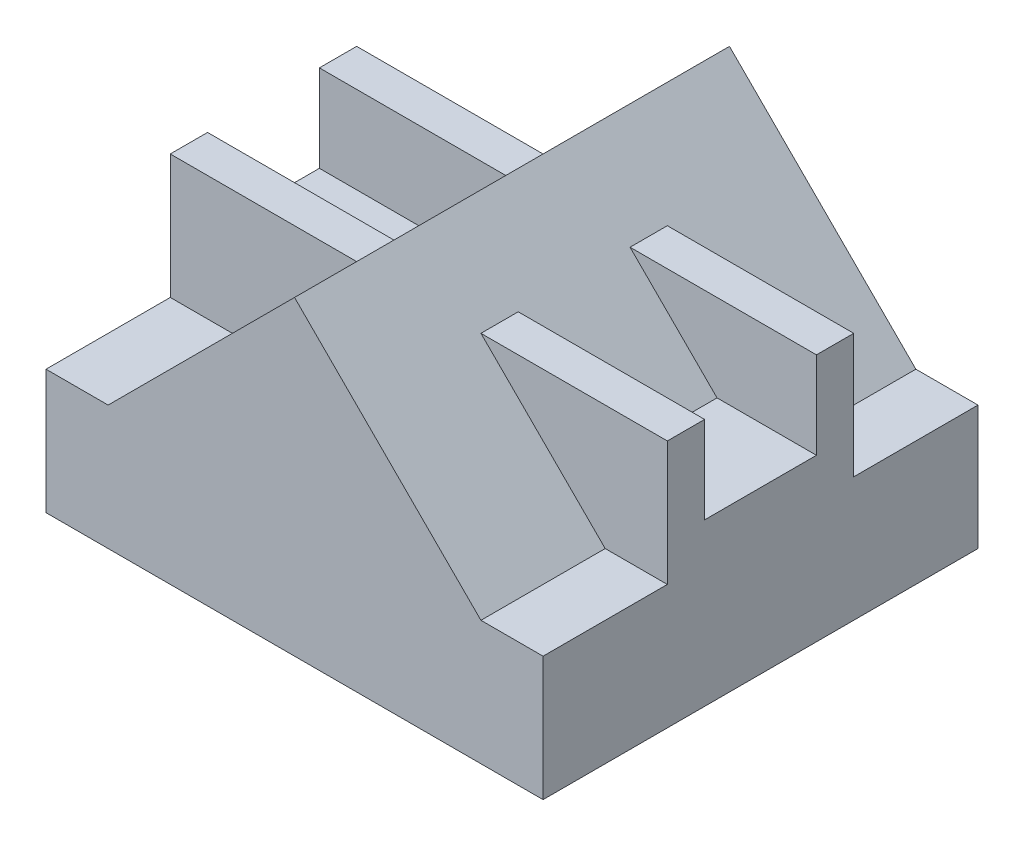
ISO-10303-21;
HEADER;
FILE_DESCRIPTION(('STEP AP214'),'2;1');
FILE_NAME('part.step','',(''),(''),'','','');
FILE_SCHEMA(('AUTOMOTIVE_DESIGN { 1 0 10303 214 1 1 1 1 }'));
ENDSEC;
DATA;
#1=APPLICATION_CONTEXT('core data for automotive mechanical design processes');
#2=APPLICATION_PROTOCOL_DEFINITION('international standard','automotive_design',2000,#1);
#3=PRODUCT_CONTEXT('',#1,'mechanical');
#4=PRODUCT('Part','Part','',(#3));
#5=PRODUCT_RELATED_PRODUCT_CATEGORY('part','',(#4));
#6=PRODUCT_DEFINITION_FORMATION('','',#4);
#7=PRODUCT_DEFINITION_CONTEXT('part definition',#1,'design');
#8=PRODUCT_DEFINITION('design','',#6,#7);
#9=PRODUCT_DEFINITION_SHAPE('','',#8);
#10=(LENGTH_UNIT() NAMED_UNIT(*) SI_UNIT(.MILLI.,.METRE.));
#11=(NAMED_UNIT(*) PLANE_ANGLE_UNIT() SI_UNIT($,.RADIAN.));
#12=(NAMED_UNIT(*) SI_UNIT($,.STERADIAN.) SOLID_ANGLE_UNIT());
#13=UNCERTAINTY_MEASURE_WITH_UNIT(LENGTH_MEASURE(1.E-05),#10,'distance_accuracy_value','');
#14=(GEOMETRIC_REPRESENTATION_CONTEXT(3) GLOBAL_UNCERTAINTY_ASSIGNED_CONTEXT((#13)) GLOBAL_UNIT_ASSIGNED_CONTEXT((#10,
#11,#12)) REPRESENTATION_CONTEXT('',''));
#15=CARTESIAN_POINT('',(0.,0.,0.));
#16=DIRECTION('',(0.,0.,1.));
#17=DIRECTION('',(1.,0.,0.));
#18=AXIS2_PLACEMENT_3D('',#15,#16,#17);
#19=CARTESIAN_POINT('',(0.,50.,0.));
#20=DIRECTION('',(0.,1.,0.));
#21=DIRECTION('',(0.,0.,1.));
#22=AXIS2_PLACEMENT_3D('',#19,#20,#21);
#23=PLANE('',#22);
#24=DIRECTION('',(1.,0.,0.));
#25=VECTOR('',#24,1.);
#26=CARTESIAN_POINT('',(-190.1387818866,50.,37.5000000000001));
#27=LINE('',#26,#25);
#28=CARTESIAN_POINT('',(75.,50.,37.5));
#29=VERTEX_POINT('',#28);
#30=CARTESIAN_POINT('',(100.,50.,37.5000000000001));
#31=VERTEX_POINT('',#30);
#32=EDGE_CURVE('E256',#29,#31,#27,.T.);
#33=ORIENTED_EDGE('',*,*,#32,.F.);
#34=DIRECTION('',(0.,0.,1.));
#35=VECTOR('',#34,1.);
#36=CARTESIAN_POINT('',(75.,50.,-255.205098312484));
#37=LINE('',#36,#35);
#38=CARTESIAN_POINT('',(75.,50.,87.5));
#39=VERTEX_POINT('',#38);
#40=EDGE_CURVE('E331',#29,#39,#37,.T.);
#41=ORIENTED_EDGE('',*,*,#40,.T.);
#42=DIRECTION('',(1.,0.,0.));
#43=VECTOR('',#42,1.);
#44=CARTESIAN_POINT('',(-99.9999999999999,50.,87.5));
#45=LINE('',#44,#43);
#46=CARTESIAN_POINT('',(100.,50.,87.5));
#47=VERTEX_POINT('',#46);
#48=EDGE_CURVE('E355',#39,#47,#45,.T.);
#49=ORIENTED_EDGE('',*,*,#48,.T.);
#50=DIRECTION('',(0.,0.,-1.));
#51=VECTOR('',#50,1.);
#52=CARTESIAN_POINT('',(100.,50.,-87.5));
#53=LINE('',#52,#51);
#54=EDGE_CURVE('E67',#47,#31,#53,.T.);
#55=ORIENTED_EDGE('',*,*,#54,.T.);
#56=EDGE_LOOP('',(#33,#41,#49,#55));
#57=FACE_BOUND('',#56,.T.);
#58=ADVANCED_FACE('F43',(#57),#23,.T.);
#59=CARTESIAN_POINT('',(-100.,50.,37.5000000000001));
#60=VERTEX_POINT('',#59);
#61=CARTESIAN_POINT('',(-75.,50.,37.5000000000001));
#62=VERTEX_POINT('',#61);
#63=EDGE_CURVE('E251',#60,#62,#27,.T.);
#64=ORIENTED_EDGE('',*,*,#63,.F.);
#65=DIRECTION('',(0.,0.,1.));
#66=VECTOR('',#65,1.);
#67=CARTESIAN_POINT('',(-100.,50.,-87.5));
#68=LINE('',#67,#66);
#69=CARTESIAN_POINT('',(-99.9999999999999,50.,87.5));
#70=VERTEX_POINT('',#69);
#71=EDGE_CURVE('E351',#60,#70,#68,.T.);
#72=ORIENTED_EDGE('',*,*,#71,.T.);
#73=CARTESIAN_POINT('',(-75.,50.,87.5));
#74=VERTEX_POINT('',#73);
#75=EDGE_CURVE('E356',#70,#74,#45,.T.);
#76=ORIENTED_EDGE('',*,*,#75,.T.);
#77=DIRECTION('',(0.,0.,1.));
#78=VECTOR('',#77,1.);
#79=CARTESIAN_POINT('',(-75.,50.,-255.205098312484));
#80=LINE('',#79,#78);
#81=EDGE_CURVE('E334',#62,#74,#80,.T.);
#82=ORIENTED_EDGE('',*,*,#81,.F.);
#83=EDGE_LOOP('',(#64,#72,#76,#82));
#84=FACE_BOUND('',#83,.T.);
#85=ADVANCED_FACE('F454',(#84),#23,.T.);
#86=DIRECTION('',(1.,0.,0.));
#87=VECTOR('',#86,1.);
#88=CARTESIAN_POINT('',(-190.1387818866,50.,-37.5));
#89=LINE('',#88,#87);
#90=CARTESIAN_POINT('',(75.,50.,-37.5));
#91=VERTEX_POINT('',#90);
#92=CARTESIAN_POINT('',(100.,50.,-37.5000000000001));
#93=VERTEX_POINT('',#92);
#94=EDGE_CURVE('E59',#91,#93,#89,.T.);
#95=ORIENTED_EDGE('',*,*,#94,.T.);
#96=CARTESIAN_POINT('',(100.,50.,-87.5));
#97=VERTEX_POINT('',#96);
#98=EDGE_CURVE('E226',#93,#97,#53,.T.);
#99=ORIENTED_EDGE('',*,*,#98,.T.);
#100=DIRECTION('',(-1.,0.,0.));
#101=VECTOR('',#100,1.);
#102=CARTESIAN_POINT('',(-100.,50.,-87.5));
#103=LINE('',#102,#101);
#104=CARTESIAN_POINT('',(75.,50.,-87.5));
#105=VERTEX_POINT('',#104);
#106=EDGE_CURVE('E348',#97,#105,#103,.T.);
#107=ORIENTED_EDGE('',*,*,#106,.T.);
#108=EDGE_CURVE('E338',#105,#91,#37,.T.);
#109=ORIENTED_EDGE('',*,*,#108,.T.);
#110=EDGE_LOOP('',(#95,#99,#107,#109));
#111=FACE_BOUND('',#110,.T.);
#112=ADVANCED_FACE('F434',(#111),#23,.T.);
#113=CARTESIAN_POINT('',(100.,50.,-87.5));
#114=DIRECTION('',(-1.,0.,0.));
#115=DIRECTION('',(0.,0.,1.));
#116=AXIS2_PLACEMENT_3D('',#113,#114,#115);
#117=PLANE('',#116);
#118=DIRECTION('',(0.,0.,-1.));
#119=VECTOR('',#118,1.);
#120=CARTESIAN_POINT('',(100.,0.,-87.5));
#121=LINE('',#120,#119);
#122=CARTESIAN_POINT('',(100.,0.,87.5));
#123=VERTEX_POINT('',#122);
#124=CARTESIAN_POINT('',(100.,0.,-87.5));
#125=VERTEX_POINT('',#124);
#126=EDGE_CURVE('E344',#123,#125,#121,.T.);
#127=ORIENTED_EDGE('',*,*,#126,.T.);
#128=DIRECTION('',(0.,-1.,0.));
#129=VECTOR('',#128,1.);
#130=CARTESIAN_POINT('',(100.,50.,-87.5));
#131=LINE('',#130,#129);
#132=EDGE_CURVE('E383',#97,#125,#131,.T.);
#133=ORIENTED_EDGE('',*,*,#132,.F.);
#134=ORIENTED_EDGE('',*,*,#98,.F.);
#135=DIRECTION('',(0.,1.,0.));
#136=VECTOR('',#135,1.);
#137=CARTESIAN_POINT('',(100.,100.,-37.5000000000001));
#138=LINE('',#137,#136);
#139=CARTESIAN_POINT('',(100.,100.,-37.5000000000001));
#140=VERTEX_POINT('',#139);
#141=EDGE_CURVE('E205',#93,#140,#138,.T.);
#142=ORIENTED_EDGE('',*,*,#141,.T.);
#143=DIRECTION('',(0.,0.,1.));
#144=VECTOR('',#143,1.);
#145=CARTESIAN_POINT('',(100.,100.,-22.5000000000001));
#146=LINE('',#145,#144);
#147=CARTESIAN_POINT('',(100.,100.,-22.5000000000001));
#148=VERTEX_POINT('',#147);
#149=EDGE_CURVE('E214',#140,#148,#146,.T.);
#150=ORIENTED_EDGE('',*,*,#149,.T.);
#151=DIRECTION('',(0.,-1.,0.));
#152=VECTOR('',#151,1.);
#153=CARTESIAN_POINT('',(100.,65.,-22.5));
#154=LINE('',#153,#152);
#155=CARTESIAN_POINT('',(100.,65.,-22.5));
#156=VERTEX_POINT('',#155);
#157=EDGE_CURVE('E222',#148,#156,#154,.T.);
#158=ORIENTED_EDGE('',*,*,#157,.T.);
#159=DIRECTION('',(0.,0.,1.));
#160=VECTOR('',#159,1.);
#161=CARTESIAN_POINT('',(100.,65.,22.5));
#162=LINE('',#161,#160);
#163=CARTESIAN_POINT('',(100.,65.,22.5));
#164=VERTEX_POINT('',#163);
#165=EDGE_CURVE('E235',#156,#164,#162,.T.);
#166=ORIENTED_EDGE('',*,*,#165,.T.);
#167=DIRECTION('',(0.,1.,0.));
#168=VECTOR('',#167,1.);
#169=CARTESIAN_POINT('',(100.,100.,22.5));
#170=LINE('',#169,#168);
#171=CARTESIAN_POINT('',(100.,100.,22.5));
#172=VERTEX_POINT('',#171);
#173=EDGE_CURVE('E239',#164,#172,#170,.T.);
#174=ORIENTED_EDGE('',*,*,#173,.T.);
#175=DIRECTION('',(0.,0.,1.));
#176=VECTOR('',#175,1.);
#177=CARTESIAN_POINT('',(100.,100.,37.5));
#178=LINE('',#177,#176);
#179=CARTESIAN_POINT('',(100.,100.,37.5));
#180=VERTEX_POINT('',#179);
#181=EDGE_CURVE('E243',#172,#180,#178,.T.);
#182=ORIENTED_EDGE('',*,*,#181,.T.);
#183=DIRECTION('',(0.,-1.,0.));
#184=VECTOR('',#183,1.);
#185=CARTESIAN_POINT('',(100.,50.,37.5));
#186=LINE('',#185,#184);
#187=EDGE_CURVE('E247',#180,#31,#186,.T.);
#188=ORIENTED_EDGE('',*,*,#187,.T.);
#189=ORIENTED_EDGE('',*,*,#54,.F.);
#190=DIRECTION('',(0.,-1.,0.));
#191=VECTOR('',#190,1.);
#192=CARTESIAN_POINT('',(100.,50.,87.5));
#193=LINE('',#192,#191);
#194=EDGE_CURVE('E360',#47,#123,#193,.T.);
#195=ORIENTED_EDGE('',*,*,#194,.T.);
#196=EDGE_LOOP('',(#127,#133,#134,#142,#150,#158,#166,#174,#182,#188,#189,#195));
#197=FACE_BOUND('',#196,.T.);
#198=ADVANCED_FACE('F45',(#197),#117,.F.);
#199=CARTESIAN_POINT('',(-100.,50.,-87.5));
#200=DIRECTION('',(0.,0.,1.));
#201=DIRECTION('',(1.,0.,0.));
#202=AXIS2_PLACEMENT_3D('',#199,#200,#201);
#203=PLANE('',#202);
#204=DIRECTION('',(-1.,0.,0.));
#205=VECTOR('',#204,1.);
#206=CARTESIAN_POINT('',(-100.,0.,-87.5));
#207=LINE('',#206,#205);
#208=CARTESIAN_POINT('',(-100.,0.,-87.5));
#209=VERTEX_POINT('',#208);
#210=EDGE_CURVE('E363',#125,#209,#207,.T.);
#211=ORIENTED_EDGE('',*,*,#210,.T.);
#212=DIRECTION('',(0.,-1.,0.));
#213=VECTOR('',#212,1.);
#214=CARTESIAN_POINT('',(-100.,50.,-87.5));
#215=LINE('',#214,#213);
#216=CARTESIAN_POINT('',(-100.,50.,-87.5));
#217=VERTEX_POINT('',#216);
#218=EDGE_CURVE('E379',#217,#209,#215,.T.);
#219=ORIENTED_EDGE('',*,*,#218,.F.);
#220=CARTESIAN_POINT('',(-75.,50.,-87.5));
#221=VERTEX_POINT('',#220);
#222=EDGE_CURVE('E347',#221,#217,#103,.T.);
#223=ORIENTED_EDGE('',*,*,#222,.F.);
#224=DIRECTION('',(0.707106781186548,0.707106781186548,0.));
#225=VECTOR('',#224,1.);
#226=CARTESIAN_POINT('',(-75.,50.,-87.5));
#227=LINE('',#226,#225);
#228=CARTESIAN_POINT('',(0.,125.,-87.5));
#229=VERTEX_POINT('',#228);
#230=EDGE_CURVE('E319',#221,#229,#227,.T.);
#231=ORIENTED_EDGE('',*,*,#230,.T.);
#232=DIRECTION('',(0.707106781186548,-0.707106781186547,0.));
#233=VECTOR('',#232,1.);
#234=CARTESIAN_POINT('',(0.,125.,-87.5));
#235=LINE('',#234,#233);
#236=EDGE_CURVE('E322',#229,#105,#235,.T.);
#237=ORIENTED_EDGE('',*,*,#236,.T.);
#238=ORIENTED_EDGE('',*,*,#106,.F.);
#239=ORIENTED_EDGE('',*,*,#132,.T.);
#240=EDGE_LOOP('',(#211,#219,#223,#231,#237,#238,#239));
#241=FACE_BOUND('',#240,.T.);
#242=ADVANCED_FACE('F437',(#241),#203,.F.);
#243=CARTESIAN_POINT('',(-100.,50.,-87.5));
#244=DIRECTION('',(1.,0.,0.));
#245=DIRECTION('',(0.,0.,-1.));
#246=AXIS2_PLACEMENT_3D('',#243,#244,#245);
#247=PLANE('',#246);
#248=DIRECTION('',(0.,0.,1.));
#249=VECTOR('',#248,1.);
#250=CARTESIAN_POINT('',(-100.,0.,-87.5));
#251=LINE('',#250,#249);
#252=CARTESIAN_POINT('',(-99.9999999999999,0.,87.5));
#253=VERTEX_POINT('',#252);
#254=EDGE_CURVE('E366',#209,#253,#251,.T.);
#255=ORIENTED_EDGE('',*,*,#254,.T.);
#256=DIRECTION('',(0.,-1.,0.));
#257=VECTOR('',#256,1.);
#258=CARTESIAN_POINT('',(-99.9999999999999,50.,87.5));
#259=LINE('',#258,#257);
#260=EDGE_CURVE('E375',#70,#253,#259,.T.);
#261=ORIENTED_EDGE('',*,*,#260,.F.);
#262=ORIENTED_EDGE('',*,*,#71,.F.);
#263=DIRECTION('',(0.,1.,0.));
#264=VECTOR('',#263,1.);
#265=CARTESIAN_POINT('',(-100.,50.,37.5000000000001));
#266=LINE('',#265,#264);
#267=CARTESIAN_POINT('',(-100.,100.,37.5000000000001));
#268=VERTEX_POINT('',#267);
#269=EDGE_CURVE('E230',#60,#268,#266,.T.);
#270=ORIENTED_EDGE('',*,*,#269,.T.);
#271=DIRECTION('',(0.,0.,-1.));
#272=VECTOR('',#271,1.);
#273=CARTESIAN_POINT('',(-100.,100.,37.5000000000001));
#274=LINE('',#273,#272);
#275=CARTESIAN_POINT('',(-100.,100.,22.5000000000001));
#276=VERTEX_POINT('',#275);
#277=EDGE_CURVE('E476',#268,#276,#274,.T.);
#278=ORIENTED_EDGE('',*,*,#277,.T.);
#279=DIRECTION('',(0.,-1.,0.));
#280=VECTOR('',#279,1.);
#281=CARTESIAN_POINT('',(-100.,100.,22.5000000000001));
#282=LINE('',#281,#280);
#283=CARTESIAN_POINT('',(-100.,65.,22.5000000000001));
#284=VERTEX_POINT('',#283);
#285=EDGE_CURVE('E478',#276,#284,#282,.T.);
#286=ORIENTED_EDGE('',*,*,#285,.T.);
#287=DIRECTION('',(0.,0.,-1.));
#288=VECTOR('',#287,1.);
#289=CARTESIAN_POINT('',(-100.,65.,22.5000000000001));
#290=LINE('',#289,#288);
#291=CARTESIAN_POINT('',(-100.,65.,-22.5));
#292=VERTEX_POINT('',#291);
#293=EDGE_CURVE('E480',#284,#292,#290,.T.);
#294=ORIENTED_EDGE('',*,*,#293,.T.);
#295=DIRECTION('',(0.,1.,0.));
#296=VECTOR('',#295,1.);
#297=CARTESIAN_POINT('',(-100.,65.,-22.5));
#298=LINE('',#297,#296);
#299=CARTESIAN_POINT('',(-100.,100.,-22.5));
#300=VERTEX_POINT('',#299);
#301=EDGE_CURVE('E483',#292,#300,#298,.T.);
#302=ORIENTED_EDGE('',*,*,#301,.T.);
#303=DIRECTION('',(0.,0.,-1.));
#304=VECTOR('',#303,1.);
#305=CARTESIAN_POINT('',(-100.,100.,-22.5));
#306=LINE('',#305,#304);
#307=CARTESIAN_POINT('',(-100.,100.,-37.5));
#308=VERTEX_POINT('',#307);
#309=EDGE_CURVE('E255',#300,#308,#306,.T.);
#310=ORIENTED_EDGE('',*,*,#309,.T.);
#311=DIRECTION('',(0.,-1.,0.));
#312=VECTOR('',#311,1.);
#313=CARTESIAN_POINT('',(-100.,100.,-37.5));
#314=LINE('',#313,#312);
#315=CARTESIAN_POINT('',(-100.,50.,-37.5));
#316=VERTEX_POINT('',#315);
#317=EDGE_CURVE('E286',#308,#316,#314,.T.);
#318=ORIENTED_EDGE('',*,*,#317,.T.);
#319=EDGE_CURVE('E352',#217,#316,#68,.T.);
#320=ORIENTED_EDGE('',*,*,#319,.F.);
#321=ORIENTED_EDGE('',*,*,#218,.T.);
#322=EDGE_LOOP('',(#255,#261,#262,#270,#278,#286,#294,#302,#310,#318,#320,#321));
#323=FACE_BOUND('',#322,.T.);
#324=ADVANCED_FACE('F465',(#323),#247,.F.);
#325=CARTESIAN_POINT('',(-99.9999999999999,50.,87.5));
#326=DIRECTION('',(0.,0.,-1.));
#327=DIRECTION('',(-1.,0.,0.));
#328=AXIS2_PLACEMENT_3D('',#325,#326,#327);
#329=PLANE('',#328);
#330=DIRECTION('',(1.,0.,0.));
#331=VECTOR('',#330,1.);
#332=CARTESIAN_POINT('',(-99.9999999999999,0.,87.5));
#333=LINE('',#332,#331);
#334=EDGE_CURVE('E369',#253,#123,#333,.T.);
#335=ORIENTED_EDGE('',*,*,#334,.T.);
#336=ORIENTED_EDGE('',*,*,#194,.F.);
#337=ORIENTED_EDGE('',*,*,#48,.F.);
#338=DIRECTION('',(-0.707106781186548,0.707106781186547,0.));
#339=VECTOR('',#338,1.);
#340=CARTESIAN_POINT('',(0.,125.,87.5));
#341=LINE('',#340,#339);
#342=CARTESIAN_POINT('',(0.,125.,87.5));
#343=VERTEX_POINT('',#342);
#344=EDGE_CURVE('E318',#39,#343,#341,.T.);
#345=ORIENTED_EDGE('',*,*,#344,.T.);
#346=DIRECTION('',(-0.707106781186548,-0.707106781186548,0.));
#347=VECTOR('',#346,1.);
#348=CARTESIAN_POINT('',(-75.,50.,87.5));
#349=LINE('',#348,#347);
#350=EDGE_CURVE('E327',#343,#74,#349,.T.);
#351=ORIENTED_EDGE('',*,*,#350,.T.);
#352=ORIENTED_EDGE('',*,*,#75,.F.);
#353=ORIENTED_EDGE('',*,*,#260,.T.);
#354=EDGE_LOOP('',(#335,#336,#337,#345,#351,#352,#353));
#355=FACE_BOUND('',#354,.T.);
#356=ADVANCED_FACE('F447',(#355),#329,.F.);
#357=CARTESIAN_POINT('',(-75.,50.,-37.5));
#358=VERTEX_POINT('',#357);
#359=EDGE_CURVE('E211',#316,#358,#89,.T.);
#360=ORIENTED_EDGE('',*,*,#359,.T.);
#361=EDGE_CURVE('E323',#221,#358,#80,.T.);
#362=ORIENTED_EDGE('',*,*,#361,.F.);
#363=ORIENTED_EDGE('',*,*,#222,.T.);
#364=ORIENTED_EDGE('',*,*,#319,.T.);
#365=EDGE_LOOP('',(#360,#362,#363,#364));
#366=FACE_BOUND('',#365,.T.);
#367=ADVANCED_FACE('F469',(#366),#23,.T.);
#368=CARTESIAN_POINT('',(0.,0.,0.));
#369=DIRECTION('',(0.,1.,0.));
#370=DIRECTION('',(0.,0.,1.));
#371=AXIS2_PLACEMENT_3D('',#368,#369,#370);
#372=PLANE('',#371);
#373=ORIENTED_EDGE('',*,*,#126,.F.);
#374=ORIENTED_EDGE('',*,*,#334,.F.);
#375=ORIENTED_EDGE('',*,*,#254,.F.);
#376=ORIENTED_EDGE('',*,*,#210,.F.);
#377=EDGE_LOOP('',(#373,#374,#375,#376));
#378=FACE_BOUND('',#377,.T.);
#379=ADVANCED_FACE('F462',(#378),#372,.F.);
#380=CARTESIAN_POINT('',(-75.,50.,-255.205098312484));
#381=DIRECTION('',(-0.707106781186548,0.707106781186548,0.));
#382=DIRECTION('',(-0.707106781186548,-0.707106781186548,0.));
#383=AXIS2_PLACEMENT_3D('',#380,#381,#382);
#384=PLANE('',#383);
#385=DIRECTION('',(0.707106781186548,0.707106781186548,0.));
#386=VECTOR('',#385,1.);
#387=CARTESIAN_POINT('',(-75.,50.,37.5000000000001));
#388=LINE('',#387,#386);
#389=CARTESIAN_POINT('',(-25.,100.,37.5000000000001));
#390=VERTEX_POINT('',#389);
#391=EDGE_CURVE('E314',#62,#390,#388,.T.);
#392=ORIENTED_EDGE('',*,*,#391,.F.);
#393=ORIENTED_EDGE('',*,*,#81,.T.);
#394=ORIENTED_EDGE('',*,*,#350,.F.);
#395=DIRECTION('',(0.,0.,1.));
#396=VECTOR('',#395,1.);
#397=CARTESIAN_POINT('',(0.,125.,-255.205098312484));
#398=LINE('',#397,#396);
#399=EDGE_CURVE('E335',#229,#343,#398,.T.);
#400=ORIENTED_EDGE('',*,*,#399,.F.);
#401=ORIENTED_EDGE('',*,*,#230,.F.);
#402=ORIENTED_EDGE('',*,*,#361,.T.);
#403=DIRECTION('',(-0.707106781186548,-0.707106781186548,0.));
#404=VECTOR('',#403,1.);
#405=CARTESIAN_POINT('',(-75.,50.,-37.5));
#406=LINE('',#405,#404);
#407=CARTESIAN_POINT('',(-25.,100.,-37.5));
#408=VERTEX_POINT('',#407);
#409=EDGE_CURVE('E290',#408,#358,#406,.T.);
#410=ORIENTED_EDGE('',*,*,#409,.F.);
#411=DIRECTION('',(0.,0.,-1.));
#412=VECTOR('',#411,1.);
#413=CARTESIAN_POINT('',(-25.,100.,-255.205098312484));
#414=LINE('',#413,#412);
#415=CARTESIAN_POINT('',(-25.,100.,-22.5));
#416=VERTEX_POINT('',#415);
#417=EDGE_CURVE('E294',#416,#408,#414,.T.);
#418=ORIENTED_EDGE('',*,*,#417,.F.);
#419=DIRECTION('',(0.707106781186548,0.707106781186548,0.));
#420=VECTOR('',#419,1.);
#421=CARTESIAN_POINT('',(-74.9999999999999,50.,-22.5));
#422=LINE('',#421,#420);
#423=CARTESIAN_POINT('',(-60.,65.,-22.5));
#424=VERTEX_POINT('',#423);
#425=EDGE_CURVE('E298',#424,#416,#422,.T.);
#426=ORIENTED_EDGE('',*,*,#425,.F.);
#427=DIRECTION('',(0.,0.,-1.));
#428=VECTOR('',#427,1.);
#429=CARTESIAN_POINT('',(-60.,65.,-255.205098312484));
#430=LINE('',#429,#428);
#431=CARTESIAN_POINT('',(-60.,65.,22.5000000000001));
#432=VERTEX_POINT('',#431);
#433=EDGE_CURVE('E302',#432,#424,#430,.T.);
#434=ORIENTED_EDGE('',*,*,#433,.F.);
#435=DIRECTION('',(-0.707106781186548,-0.707106781186548,0.));
#436=VECTOR('',#435,1.);
#437=CARTESIAN_POINT('',(-75.,50.,22.5));
#438=LINE('',#437,#436);
#439=CARTESIAN_POINT('',(-25.,100.,22.5));
#440=VERTEX_POINT('',#439);
#441=EDGE_CURVE('E306',#440,#432,#438,.T.);
#442=ORIENTED_EDGE('',*,*,#441,.F.);
#443=DIRECTION('',(0.,0.,-1.));
#444=VECTOR('',#443,1.);
#445=CARTESIAN_POINT('',(-25.,100.,-255.205098312484));
#446=LINE('',#445,#444);
#447=EDGE_CURVE('E310',#390,#440,#446,.T.);
#448=ORIENTED_EDGE('',*,*,#447,.F.);
#449=EDGE_LOOP('',(#392,#393,#394,#400,#401,#402,#410,#418,#426,#434,#442,#448));
#450=FACE_BOUND('',#449,.T.);
#451=ADVANCED_FACE('F450',(#450),#384,.T.);
#452=CARTESIAN_POINT('',(0.,125.,-255.205098312484));
#453=DIRECTION('',(0.707106781186547,0.707106781186548,0.));
#454=DIRECTION('',(-0.707106781186548,0.707106781186547,0.));
#455=AXIS2_PLACEMENT_3D('',#452,#453,#454);
#456=PLANE('',#455);
#457=DIRECTION('',(0.707106781186548,-0.707106781186547,0.));
#458=VECTOR('',#457,1.);
#459=CARTESIAN_POINT('',(0.,125.,37.5));
#460=LINE('',#459,#458);
#461=CARTESIAN_POINT('',(25.,100.,37.5000000000001));
#462=VERTEX_POINT('',#461);
#463=EDGE_CURVE('E11',#462,#29,#460,.T.);
#464=ORIENTED_EDGE('',*,*,#463,.F.);
#465=DIRECTION('',(0.,0.,1.));
#466=VECTOR('',#465,1.);
#467=CARTESIAN_POINT('',(25.,100.,-255.205098312484));
#468=LINE('',#467,#466);
#469=CARTESIAN_POINT('',(25.,100.,22.5));
#470=VERTEX_POINT('',#469);
#471=EDGE_CURVE('E52',#470,#462,#468,.T.);
#472=ORIENTED_EDGE('',*,*,#471,.F.);
#473=DIRECTION('',(-0.707106781186548,0.707106781186547,0.));
#474=VECTOR('',#473,1.);
#475=CARTESIAN_POINT('',(0.,125.,22.5));
#476=LINE('',#475,#474);
#477=CARTESIAN_POINT('',(60.,65.,22.5000000000001));
#478=VERTEX_POINT('',#477);
#479=EDGE_CURVE('E400',#478,#470,#476,.T.);
#480=ORIENTED_EDGE('',*,*,#479,.F.);
#481=DIRECTION('',(0.,0.,1.));
#482=VECTOR('',#481,1.);
#483=CARTESIAN_POINT('',(60.,65.,-255.205098312484));
#484=LINE('',#483,#482);
#485=CARTESIAN_POINT('',(60.0000000000001,65.,-22.5));
#486=VERTEX_POINT('',#485);
#487=EDGE_CURVE('E396',#486,#478,#484,.T.);
#488=ORIENTED_EDGE('',*,*,#487,.F.);
#489=DIRECTION('',(0.707106781186548,-0.707106781186547,0.));
#490=VECTOR('',#489,1.);
#491=CARTESIAN_POINT('',(0.,125.,-22.5));
#492=LINE('',#491,#490);
#493=CARTESIAN_POINT('',(25.,100.,-22.5));
#494=VERTEX_POINT('',#493);
#495=EDGE_CURVE('E392',#494,#486,#492,.T.);
#496=ORIENTED_EDGE('',*,*,#495,.F.);
#497=DIRECTION('',(0.,0.,1.));
#498=VECTOR('',#497,1.);
#499=CARTESIAN_POINT('',(25.,100.,-255.205098312484));
#500=LINE('',#499,#498);
#501=CARTESIAN_POINT('',(25.,100.,-37.5));
#502=VERTEX_POINT('',#501);
#503=EDGE_CURVE('E389',#502,#494,#500,.T.);
#504=ORIENTED_EDGE('',*,*,#503,.F.);
#505=DIRECTION('',(-0.707106781186548,0.707106781186547,0.));
#506=VECTOR('',#505,1.);
#507=CARTESIAN_POINT('',(0.,125.,-37.5));
#508=LINE('',#507,#506);
#509=EDGE_CURVE('E206',#91,#502,#508,.T.);
#510=ORIENTED_EDGE('',*,*,#509,.F.);
#511=ORIENTED_EDGE('',*,*,#108,.F.);
#512=ORIENTED_EDGE('',*,*,#236,.F.);
#513=ORIENTED_EDGE('',*,*,#399,.T.);
#514=ORIENTED_EDGE('',*,*,#344,.F.);
#515=ORIENTED_EDGE('',*,*,#40,.F.);
#516=EDGE_LOOP('',(#464,#472,#480,#488,#496,#504,#510,#511,#512,#513,#514,#515));
#517=FACE_BOUND('',#516,.T.);
#518=ADVANCED_FACE('F431',(#517),#456,.T.);
#519=CARTESIAN_POINT('',(-190.1387818866,100.,-37.5));
#520=DIRECTION('',(0.,0.,-1.));
#521=DIRECTION('',(-1.,0.,0.));
#522=AXIS2_PLACEMENT_3D('',#519,#520,#521);
#523=PLANE('',#522);
#524=ORIENTED_EDGE('',*,*,#94,.F.);
#525=ORIENTED_EDGE('',*,*,#509,.T.);
#526=DIRECTION('',(1.,0.,0.));
#527=VECTOR('',#526,1.);
#528=CARTESIAN_POINT('',(-190.1387818866,100.,-37.5));
#529=LINE('',#528,#527);
#530=EDGE_CURVE('E201',#502,#140,#529,.T.);
#531=ORIENTED_EDGE('',*,*,#530,.T.);
#532=ORIENTED_EDGE('',*,*,#141,.F.);
#533=EDGE_LOOP('',(#524,#525,#531,#532));
#534=FACE_BOUND('',#533,.T.);
#535=ADVANCED_FACE('F203',(#534),#523,.T.);
#536=CARTESIAN_POINT('',(-190.1387818866,100.,-22.5));
#537=DIRECTION('',(0.,1.,0.));
#538=DIRECTION('',(0.,0.,1.));
#539=AXIS2_PLACEMENT_3D('',#536,#537,#538);
#540=PLANE('',#539);
#541=ORIENTED_EDGE('',*,*,#530,.F.);
#542=ORIENTED_EDGE('',*,*,#503,.T.);
#543=DIRECTION('',(1.,0.,0.));
#544=VECTOR('',#543,1.);
#545=CARTESIAN_POINT('',(-190.1387818866,100.,-22.5));
#546=LINE('',#545,#544);
#547=EDGE_CURVE('E217',#494,#148,#546,.T.);
#548=ORIENTED_EDGE('',*,*,#547,.T.);
#549=ORIENTED_EDGE('',*,*,#149,.F.);
#550=EDGE_LOOP('',(#541,#542,#548,#549));
#551=FACE_BOUND('',#550,.T.);
#552=ADVANCED_FACE('F215',(#551),#540,.T.);
#553=CARTESIAN_POINT('',(-190.1387818866,65.,-22.5));
#554=DIRECTION('',(0.,0.,1.));
#555=DIRECTION('',(1.,0.,0.));
#556=AXIS2_PLACEMENT_3D('',#553,#554,#555);
#557=PLANE('',#556);
#558=ORIENTED_EDGE('',*,*,#547,.F.);
#559=ORIENTED_EDGE('',*,*,#495,.T.);
#560=DIRECTION('',(1.,0.,0.));
#561=VECTOR('',#560,1.);
#562=CARTESIAN_POINT('',(-190.1387818866,65.,-22.5));
#563=LINE('',#562,#561);
#564=EDGE_CURVE('E276',#486,#156,#563,.T.);
#565=ORIENTED_EDGE('',*,*,#564,.T.);
#566=ORIENTED_EDGE('',*,*,#157,.F.);
#567=EDGE_LOOP('',(#558,#559,#565,#566));
#568=FACE_BOUND('',#567,.T.);
#569=ADVANCED_FACE('F424',(#568),#557,.T.);
#570=CARTESIAN_POINT('',(-190.1387818866,65.,22.5000000000001));
#571=DIRECTION('',(0.,1.,0.));
#572=DIRECTION('',(0.,0.,1.));
#573=AXIS2_PLACEMENT_3D('',#570,#571,#572);
#574=PLANE('',#573);
#575=ORIENTED_EDGE('',*,*,#564,.F.);
#576=ORIENTED_EDGE('',*,*,#487,.T.);
#577=DIRECTION('',(1.,0.,0.));
#578=VECTOR('',#577,1.);
#579=CARTESIAN_POINT('',(-190.1387818866,65.,22.5000000000001));
#580=LINE('',#579,#578);
#581=EDGE_CURVE('E271',#478,#164,#580,.T.);
#582=ORIENTED_EDGE('',*,*,#581,.T.);
#583=ORIENTED_EDGE('',*,*,#165,.F.);
#584=EDGE_LOOP('',(#575,#576,#582,#583));
#585=FACE_BOUND('',#584,.T.);
#586=ADVANCED_FACE('F426',(#585),#574,.T.);
#587=CARTESIAN_POINT('',(-190.1387818866,100.,22.5000000000001));
#588=DIRECTION('',(0.,0.,-1.));
#589=DIRECTION('',(-1.,0.,0.));
#590=AXIS2_PLACEMENT_3D('',#587,#588,#589);
#591=PLANE('',#590);
#592=ORIENTED_EDGE('',*,*,#581,.F.);
#593=ORIENTED_EDGE('',*,*,#479,.T.);
#594=DIRECTION('',(1.,0.,0.));
#595=VECTOR('',#594,1.);
#596=CARTESIAN_POINT('',(-190.1387818866,100.,22.5000000000001));
#597=LINE('',#596,#595);
#598=EDGE_CURVE('E266',#470,#172,#597,.T.);
#599=ORIENTED_EDGE('',*,*,#598,.T.);
#600=ORIENTED_EDGE('',*,*,#173,.F.);
#601=EDGE_LOOP('',(#592,#593,#599,#600));
#602=FACE_BOUND('',#601,.T.);
#603=ADVANCED_FACE('F430',(#602),#591,.T.);
#604=CARTESIAN_POINT('',(-190.1387818866,100.,37.5000000000001));
#605=DIRECTION('',(0.,1.,0.));
#606=DIRECTION('',(0.,0.,1.));
#607=AXIS2_PLACEMENT_3D('',#604,#605,#606);
#608=PLANE('',#607);
#609=ORIENTED_EDGE('',*,*,#598,.F.);
#610=ORIENTED_EDGE('',*,*,#471,.T.);
#611=DIRECTION('',(1.,0.,0.));
#612=VECTOR('',#611,1.);
#613=CARTESIAN_POINT('',(-190.1387818866,100.,37.5000000000001));
#614=LINE('',#613,#612);
#615=EDGE_CURVE('E261',#462,#180,#614,.T.);
#616=ORIENTED_EDGE('',*,*,#615,.T.);
#617=ORIENTED_EDGE('',*,*,#181,.F.);
#618=EDGE_LOOP('',(#609,#610,#616,#617));
#619=FACE_BOUND('',#618,.T.);
#620=ADVANCED_FACE('F408',(#619),#608,.T.);
#621=CARTESIAN_POINT('',(-190.1387818866,50.,37.5000000000001));
#622=DIRECTION('',(0.,0.,1.));
#623=DIRECTION('',(1.,0.,0.));
#624=AXIS2_PLACEMENT_3D('',#621,#622,#623);
#625=PLANE('',#624);
#626=ORIENTED_EDGE('',*,*,#615,.F.);
#627=ORIENTED_EDGE('',*,*,#463,.T.);
#628=ORIENTED_EDGE('',*,*,#32,.T.);
#629=ORIENTED_EDGE('',*,*,#187,.F.);
#630=EDGE_LOOP('',(#626,#627,#628,#629));
#631=FACE_BOUND('',#630,.T.);
#632=ADVANCED_FACE('F413',(#631),#625,.T.);
#633=ORIENTED_EDGE('',*,*,#63,.T.);
#634=ORIENTED_EDGE('',*,*,#391,.T.);
#635=EDGE_CURVE('E257',#268,#390,#614,.T.);
#636=ORIENTED_EDGE('',*,*,#635,.F.);
#637=ORIENTED_EDGE('',*,*,#269,.F.);
#638=EDGE_LOOP('',(#633,#634,#636,#637));
#639=FACE_BOUND('',#638,.T.);
#640=ADVANCED_FACE('F630',(#639),#625,.T.);
#641=ORIENTED_EDGE('',*,*,#635,.T.);
#642=ORIENTED_EDGE('',*,*,#447,.T.);
#643=EDGE_CURVE('E262',#276,#440,#597,.T.);
#644=ORIENTED_EDGE('',*,*,#643,.F.);
#645=ORIENTED_EDGE('',*,*,#277,.F.);
#646=EDGE_LOOP('',(#641,#642,#644,#645));
#647=FACE_BOUND('',#646,.T.);
#648=ADVANCED_FACE('F621',(#647),#608,.T.);
#649=ORIENTED_EDGE('',*,*,#643,.T.);
#650=ORIENTED_EDGE('',*,*,#441,.T.);
#651=EDGE_CURVE('E267',#284,#432,#580,.T.);
#652=ORIENTED_EDGE('',*,*,#651,.F.);
#653=ORIENTED_EDGE('',*,*,#285,.F.);
#654=EDGE_LOOP('',(#649,#650,#652,#653));
#655=FACE_BOUND('',#654,.T.);
#656=ADVANCED_FACE('F611',(#655),#591,.T.);
#657=ORIENTED_EDGE('',*,*,#651,.T.);
#658=ORIENTED_EDGE('',*,*,#433,.T.);
#659=EDGE_CURVE('E272',#292,#424,#563,.T.);
#660=ORIENTED_EDGE('',*,*,#659,.F.);
#661=ORIENTED_EDGE('',*,*,#293,.F.);
#662=EDGE_LOOP('',(#657,#658,#660,#661));
#663=FACE_BOUND('',#662,.T.);
#664=ADVANCED_FACE('F601',(#663),#574,.T.);
#665=ORIENTED_EDGE('',*,*,#659,.T.);
#666=ORIENTED_EDGE('',*,*,#425,.T.);
#667=EDGE_CURVE('E277',#300,#416,#546,.T.);
#668=ORIENTED_EDGE('',*,*,#667,.F.);
#669=ORIENTED_EDGE('',*,*,#301,.F.);
#670=EDGE_LOOP('',(#665,#666,#668,#669));
#671=FACE_BOUND('',#670,.T.);
#672=ADVANCED_FACE('F591',(#671),#557,.T.);
#673=ORIENTED_EDGE('',*,*,#667,.T.);
#674=ORIENTED_EDGE('',*,*,#417,.T.);
#675=EDGE_CURVE('E210',#308,#408,#529,.T.);
#676=ORIENTED_EDGE('',*,*,#675,.F.);
#677=ORIENTED_EDGE('',*,*,#309,.F.);
#678=EDGE_LOOP('',(#673,#674,#676,#677));
#679=FACE_BOUND('',#678,.T.);
#680=ADVANCED_FACE('F581',(#679),#540,.T.);
#681=ORIENTED_EDGE('',*,*,#675,.T.);
#682=ORIENTED_EDGE('',*,*,#409,.T.);
#683=ORIENTED_EDGE('',*,*,#359,.F.);
#684=ORIENTED_EDGE('',*,*,#317,.F.);
#685=EDGE_LOOP('',(#681,#682,#683,#684));
#686=FACE_BOUND('',#685,.T.);
#687=ADVANCED_FACE('F570',(#686),#523,.T.);
#688=CLOSED_SHELL('',(#58,#85,#112,#198,#242,#324,#356,#367,#379,#451,#518,#535,#552,#569,#586,
#603,#620,#632,#640,#648,#656,#664,#672,#680,#687));
#689=MANIFOLD_SOLID_BREP('B2',#688);
#690=ADVANCED_BREP_SHAPE_REPRESENTATION('',(#18,#689),#14);
#691=SHAPE_DEFINITION_REPRESENTATION(#9,#690);
ENDSEC;
END-ISO-10303-21;
